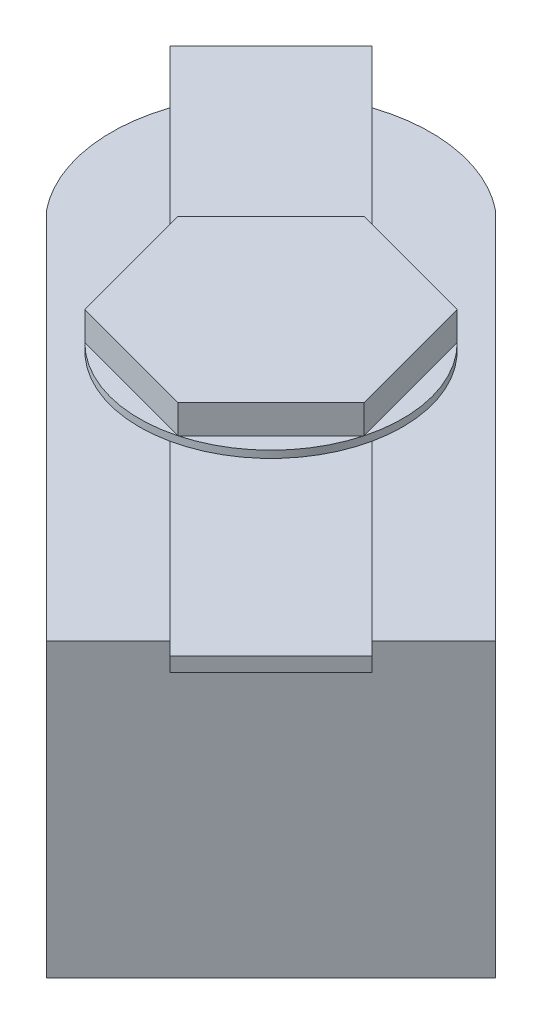
ISO-10303-21;
HEADER;
FILE_DESCRIPTION(('STEP AP214'),'2;1');
FILE_NAME('part.step','',(''),(''),'','','');
FILE_SCHEMA(('AUTOMOTIVE_DESIGN { 1 0 10303 214 1 1 1 1 }'));
ENDSEC;
DATA;
#1=APPLICATION_CONTEXT('core data for automotive mechanical design processes');
#2=APPLICATION_PROTOCOL_DEFINITION('international standard','automotive_design',2000,#1);
#3=PRODUCT_CONTEXT('',#1,'mechanical');
#4=PRODUCT('Part','Part','',(#3));
#5=PRODUCT_RELATED_PRODUCT_CATEGORY('part','',(#4));
#6=PRODUCT_DEFINITION_FORMATION('','',#4);
#7=PRODUCT_DEFINITION_CONTEXT('part definition',#1,'design');
#8=PRODUCT_DEFINITION('design','',#6,#7);
#9=PRODUCT_DEFINITION_SHAPE('','',#8);
#10=(LENGTH_UNIT() NAMED_UNIT(*) SI_UNIT(.MILLI.,.METRE.));
#11=(NAMED_UNIT(*) PLANE_ANGLE_UNIT() SI_UNIT($,.RADIAN.));
#12=(NAMED_UNIT(*) SI_UNIT($,.STERADIAN.) SOLID_ANGLE_UNIT());
#13=UNCERTAINTY_MEASURE_WITH_UNIT(LENGTH_MEASURE(1.E-05),#10,'distance_accuracy_value','');
#14=(GEOMETRIC_REPRESENTATION_CONTEXT(3) GLOBAL_UNCERTAINTY_ASSIGNED_CONTEXT((#13)) GLOBAL_UNIT_ASSIGNED_CONTEXT((#10,
#11,#12)) REPRESENTATION_CONTEXT('',''));
#15=CARTESIAN_POINT('',(0.,0.,0.));
#16=DIRECTION('',(0.,0.,1.));
#17=DIRECTION('',(1.,0.,0.));
#18=AXIS2_PLACEMENT_3D('',#15,#16,#17);
#19=CARTESIAN_POINT('',(0.,10.7,0.));
#20=DIRECTION('',(0.,1.,0.));
#21=DIRECTION('',(0.,0.,1.));
#22=AXIS2_PLACEMENT_3D('',#19,#20,#21);
#23=PLANE('',#22);
#24=DIRECTION('',(0.707106781186548,0.,0.707106781186548));
#25=VECTOR('',#24,1.);
#26=CARTESIAN_POINT('',(1.76776695296635,10.7,-1.76776695296635));
#27=LINE('',#26,#25);
#28=CARTESIAN_POINT('',(4.49815154126155,10.7,0.962617635328844));
#29=VERTEX_POINT('',#28);
#30=CARTESIAN_POINT('',(10.9955104474508,10.7,7.45997654151807));
#31=VERTEX_POINT('',#30);
#32=EDGE_CURVE('E308',#29,#31,#27,.T.);
#33=ORIENTED_EDGE('',*,*,#32,.F.);
#34=CARTESIAN_POINT('',(0.,10.7,0.));
#35=DIRECTION('',(0.,1.,0.));
#36=DIRECTION('',(0.,0.,1.));
#37=AXIS2_PLACEMENT_3D('',#34,#35,#36);
#38=CIRCLE('',#37,4.6);
#39=CARTESIAN_POINT('',(0.962617635328822,10.7,4.49815154126159));
#40=VERTEX_POINT('',#39);
#41=EDGE_CURVE('E251',#40,#29,#38,.T.);
#42=ORIENTED_EDGE('',*,*,#41,.F.);
#43=DIRECTION('',(0.707106781186548,0.,0.707106781186548));
#44=VECTOR('',#43,1.);
#45=CARTESIAN_POINT('',(-1.76776695296639,10.7,1.76776695296639));
#46=LINE('',#45,#44);
#47=CARTESIAN_POINT('',(7.45997654151804,10.7,10.9955104474508));
#48=VERTEX_POINT('',#47);
#49=EDGE_CURVE('E304',#40,#48,#46,.T.);
#50=ORIENTED_EDGE('',*,*,#49,.T.);
#51=DIRECTION('',(0.707106781186548,0.,-0.707106781186548));
#52=VECTOR('',#51,1.);
#53=CARTESIAN_POINT('',(9.22774349448443,10.7,9.22774349448443));
#54=LINE('',#53,#52);
#55=EDGE_CURVE('E303',#48,#31,#54,.T.);
#56=ORIENTED_EDGE('',*,*,#55,.T.);
#57=EDGE_LOOP('',(#33,#42,#50,#56));
#58=FACE_BOUND('',#57,.T.);
#59=ADVANCED_FACE('F47',(#58),#23,.T.);
#60=CARTESIAN_POINT('',(0.,10.2,0.));
#61=DIRECTION('',(0.,1.,0.));
#62=DIRECTION('',(0.,0.,1.));
#63=AXIS2_PLACEMENT_3D('',#60,#61,#62);
#64=PLANE('',#63);
#65=CARTESIAN_POINT('',(-4.32731672416639,10.2,-4.32731672416636));
#66=DIRECTION('',(0.,1.,0.));
#67=DIRECTION('',(0.,0.,1.));
#68=AXIS2_PLACEMENT_3D('',#65,#66,#67);
#69=CIRCLE('',#68,5.58025);
#70=CARTESIAN_POINT('',(-6.08723952956172,10.2,-9.62277343549442));
#71=VERTEX_POINT('',#70);
#72=CARTESIAN_POINT('',(-0.813172798364616,10.2,-8.66205806953525));
#73=VERTEX_POINT('',#72);
#74=EDGE_CURVE('E352',#71,#73,#69,.F.);
#75=ORIENTED_EDGE('',*,*,#74,.F.);
#76=DIRECTION('',(0.707106781186548,0.,0.707106781186548));
#77=VECTOR('',#76,1.);
#78=CARTESIAN_POINT('',(1.76776695296635,10.2,-1.76776695296635));
#79=LINE('',#78,#77);
#80=CARTESIAN_POINT('',(10.040916292849,10.2,6.50538238691625));
#81=VERTEX_POINT('',#80);
#82=EDGE_CURVE('E57',#71,#81,#79,.T.);
#83=ORIENTED_EDGE('',*,*,#82,.T.);
#84=DIRECTION('',(0.707106781186544,0.,-0.707106781186551));
#85=VECTOR('',#84,1.);
#86=CARTESIAN_POINT('',(8.27314933988265,10.2,8.27314933988256));
#87=LINE('',#86,#85);
#88=CARTESIAN_POINT('',(12.197591975468,10.2,4.34870670429721));
#89=VERTEX_POINT('',#88);
#90=EDGE_CURVE('E355',#81,#89,#87,.T.);
#91=ORIENTED_EDGE('',*,*,#90,.T.);
#92=DIRECTION('',(0.70710678118655,0.,0.707106781186545));
#93=VECTOR('',#92,1.);
#94=CARTESIAN_POINT('',(3.92444263558532,10.2,-3.92444263558535));
#95=LINE('',#94,#93);
#96=EDGE_CURVE('E360',#73,#89,#95,.T.);
#97=ORIENTED_EDGE('',*,*,#96,.F.);
#98=EDGE_LOOP('',(#75,#83,#91,#97));
#99=FACE_BOUND('',#98,.T.);
#100=ADVANCED_FACE('F435',(#99),#64,.T.);
#101=CARTESIAN_POINT('',(-4.32731672416639,10.2,-4.32731672416636));
#102=DIRECTION('',(0.,-1.,0.));
#103=DIRECTION('',(0.,0.,-1.));
#104=AXIS2_PLACEMENT_3D('',#101,#102,#103);
#105=CYLINDRICAL_SURFACE('',#104,5.58025);
#106=CARTESIAN_POINT('',(-4.32731672416639,0.,-4.32731672416636));
#107=DIRECTION('',(0.,1.,0.));
#108=DIRECTION('',(0.,0.,1.));
#109=AXIS2_PLACEMENT_3D('',#106,#107,#108);
#110=CIRCLE('',#109,5.58025);
#111=CARTESIAN_POINT('',(-8.66205806953523,0.,-0.813172798364517));
#112=VERTEX_POINT('',#111);
#113=CARTESIAN_POINT('',(-0.813172798364616,0.,-8.66205806953525));
#114=VERTEX_POINT('',#113);
#115=EDGE_CURVE('E345',#112,#114,#110,.F.);
#116=ORIENTED_EDGE('',*,*,#115,.F.);
#117=DIRECTION('',(0.,-1.,0.));
#118=VECTOR('',#117,1.);
#119=CARTESIAN_POINT('',(-8.66205806953523,10.2,-0.813172798364517));
#120=LINE('',#119,#118);
#121=CARTESIAN_POINT('',(-8.66205806953523,10.2,-0.813172798364517));
#122=VERTEX_POINT('',#121);
#123=EDGE_CURVE('E51',#122,#112,#120,.T.);
#124=ORIENTED_EDGE('',*,*,#123,.F.);
#125=CARTESIAN_POINT('',(-9.62277343549446,10.2,-6.08723952956169));
#126=VERTEX_POINT('',#125);
#127=EDGE_CURVE('E346',#122,#126,#69,.F.);
#128=ORIENTED_EDGE('',*,*,#127,.T.);
#129=EDGE_CURVE('E351',#126,#71,#69,.F.);
#130=ORIENTED_EDGE('',*,*,#129,.T.);
#131=ORIENTED_EDGE('',*,*,#74,.T.);
#132=DIRECTION('',(0.,-1.,0.));
#133=VECTOR('',#132,1.);
#134=CARTESIAN_POINT('',(-0.813172798364616,10.2,-8.66205806953525));
#135=LINE('',#134,#133);
#136=EDGE_CURVE('E365',#73,#114,#135,.T.);
#137=ORIENTED_EDGE('',*,*,#136,.T.);
#138=EDGE_LOOP('',(#116,#124,#128,#130,#131,#137));
#139=FACE_BOUND('',#138,.T.);
#140=ADVANCED_FACE('F49',(#139),#105,.T.);
#141=CARTESIAN_POINT('',(-3.92444263558531,10.2,3.92444263558535));
#142=DIRECTION('',(0.707106781186544,0.,-0.707106781186551));
#143=DIRECTION('',(-0.707106781186551,0.,-0.707106781186544));
#144=AXIS2_PLACEMENT_3D('',#141,#142,#143);
#145=PLANE('',#144);
#146=DIRECTION('',(0.707106781186551,0.,0.707106781186544));
#147=VECTOR('',#146,1.);
#148=CARTESIAN_POINT('',(-3.92444263558531,0.,3.92444263558535));
#149=LINE('',#148,#147);
#150=CARTESIAN_POINT('',(4.34870670429734,0.,12.1975919754679));
#151=VERTEX_POINT('',#150);
#152=EDGE_CURVE('E369',#112,#151,#149,.T.);
#153=ORIENTED_EDGE('',*,*,#152,.T.);
#154=DIRECTION('',(0.,-1.,0.));
#155=VECTOR('',#154,1.);
#156=CARTESIAN_POINT('',(4.34870670429734,10.2,12.1975919754679));
#157=LINE('',#156,#155);
#158=CARTESIAN_POINT('',(4.34870670429734,10.2,12.1975919754679));
#159=VERTEX_POINT('',#158);
#160=EDGE_CURVE('E384',#159,#151,#157,.T.);
#161=ORIENTED_EDGE('',*,*,#160,.F.);
#162=DIRECTION('',(0.707106781186551,0.,0.707106781186544));
#163=VECTOR('',#162,1.);
#164=CARTESIAN_POINT('',(-3.92444263558531,10.2,3.92444263558535));
#165=LINE('',#164,#163);
#166=EDGE_CURVE('E350',#122,#159,#165,.T.);
#167=ORIENTED_EDGE('',*,*,#166,.F.);
#168=ORIENTED_EDGE('',*,*,#123,.T.);
#169=EDGE_LOOP('',(#153,#161,#167,#168));
#170=FACE_BOUND('',#169,.T.);
#171=ADVANCED_FACE('F424',(#170),#145,.F.);
#172=CARTESIAN_POINT('',(8.27314933988265,10.2,8.27314933988256));
#173=DIRECTION('',(-0.707106781186551,0.,-0.707106781186544));
#174=DIRECTION('',(-0.707106781186544,0.,0.707106781186551));
#175=AXIS2_PLACEMENT_3D('',#172,#173,#174);
#176=PLANE('',#175);
#177=DIRECTION('',(0.707106781186544,0.,-0.707106781186551));
#178=VECTOR('',#177,1.);
#179=CARTESIAN_POINT('',(8.27314933988265,0.,8.27314933988256));
#180=LINE('',#179,#178);
#181=CARTESIAN_POINT('',(12.197591975468,0.,4.34870670429721));
#182=VERTEX_POINT('',#181);
#183=EDGE_CURVE('E372',#151,#182,#180,.T.);
#184=ORIENTED_EDGE('',*,*,#183,.T.);
#185=DIRECTION('',(0.,-1.,0.));
#186=VECTOR('',#185,1.);
#187=CARTESIAN_POINT('',(12.197591975468,10.2,4.34870670429721));
#188=LINE('',#187,#186);
#189=EDGE_CURVE('E382',#89,#182,#188,.T.);
#190=ORIENTED_EDGE('',*,*,#189,.F.);
#191=ORIENTED_EDGE('',*,*,#90,.F.);
#192=CARTESIAN_POINT('',(6.50538238691623,10.2,10.040916292849));
#193=VERTEX_POINT('',#192);
#194=EDGE_CURVE('E361',#193,#81,#87,.T.);
#195=ORIENTED_EDGE('',*,*,#194,.F.);
#196=EDGE_CURVE('E356',#159,#193,#87,.T.);
#197=ORIENTED_EDGE('',*,*,#196,.F.);
#198=ORIENTED_EDGE('',*,*,#160,.T.);
#199=EDGE_LOOP('',(#184,#190,#191,#195,#197,#198));
#200=FACE_BOUND('',#199,.T.);
#201=ADVANCED_FACE('F420',(#200),#176,.F.);
#202=CARTESIAN_POINT('',(3.92444263558532,10.2,-3.92444263558535));
#203=DIRECTION('',(0.707106781186545,0.,-0.70710678118655));
#204=DIRECTION('',(-0.70710678118655,0.,-0.707106781186545));
#205=AXIS2_PLACEMENT_3D('',#202,#203,#204);
#206=PLANE('',#205);
#207=DIRECTION('',(0.70710678118655,0.,0.707106781186545));
#208=VECTOR('',#207,1.);
#209=CARTESIAN_POINT('',(3.92444263558532,0.,-3.92444263558535));
#210=LINE('',#209,#208);
#211=EDGE_CURVE('E376',#114,#182,#210,.T.);
#212=ORIENTED_EDGE('',*,*,#211,.F.);
#213=ORIENTED_EDGE('',*,*,#136,.F.);
#214=ORIENTED_EDGE('',*,*,#96,.T.);
#215=ORIENTED_EDGE('',*,*,#189,.T.);
#216=EDGE_LOOP('',(#212,#213,#214,#215));
#217=FACE_BOUND('',#216,.T.);
#218=ADVANCED_FACE('F434',(#217),#206,.T.);
#219=DIRECTION('',(0.707106781186548,0.,0.707106781186548));
#220=VECTOR('',#219,1.);
#221=CARTESIAN_POINT('',(-1.76776695296639,10.2,1.76776695296639));
#222=LINE('',#221,#220);
#223=EDGE_CURVE('E11',#126,#193,#222,.T.);
#224=ORIENTED_EDGE('',*,*,#223,.F.);
#225=ORIENTED_EDGE('',*,*,#127,.F.);
#226=ORIENTED_EDGE('',*,*,#166,.T.);
#227=ORIENTED_EDGE('',*,*,#196,.T.);
#228=EDGE_LOOP('',(#224,#225,#226,#227));
#229=FACE_BOUND('',#228,.T.);
#230=ADVANCED_FACE('F423',(#229),#64,.T.);
#231=CARTESIAN_POINT('',(0.,0.,0.));
#232=DIRECTION('',(0.,1.,0.));
#233=DIRECTION('',(0.,0.,1.));
#234=AXIS2_PLACEMENT_3D('',#231,#232,#233);
#235=PLANE('',#234);
#236=ORIENTED_EDGE('',*,*,#115,.T.);
#237=ORIENTED_EDGE('',*,*,#211,.T.);
#238=ORIENTED_EDGE('',*,*,#183,.F.);
#239=ORIENTED_EDGE('',*,*,#152,.F.);
#240=EDGE_LOOP('',(#236,#237,#238,#239));
#241=FACE_BOUND('',#240,.T.);
#242=ADVANCED_FACE('F427',(#241),#235,.F.);
#243=CARTESIAN_POINT('',(0.,10.2,0.));
#244=DIRECTION('',(0.,1.,0.));
#245=DIRECTION('',(0.,0.,1.));
#246=AXIS2_PLACEMENT_3D('',#243,#244,#245);
#247=PLANE('',#246);
#248=CARTESIAN_POINT('',(7.45997654151804,10.2,10.9955104474508));
#249=VERTEX_POINT('',#248);
#250=EDGE_CURVE('E60',#193,#249,#222,.T.);
#251=ORIENTED_EDGE('',*,*,#250,.F.);
#252=ORIENTED_EDGE('',*,*,#194,.T.);
#253=CARTESIAN_POINT('',(10.9955104474508,10.2,7.45997654151807));
#254=VERTEX_POINT('',#253);
#255=EDGE_CURVE('E323',#81,#254,#79,.T.);
#256=ORIENTED_EDGE('',*,*,#255,.T.);
#257=DIRECTION('',(0.707106781186548,0.,-0.707106781186548));
#258=VECTOR('',#257,1.);
#259=CARTESIAN_POINT('',(9.22774349448443,10.2,9.22774349448443));
#260=LINE('',#259,#258);
#261=EDGE_CURVE('E319',#249,#254,#260,.T.);
#262=ORIENTED_EDGE('',*,*,#261,.F.);
#263=EDGE_LOOP('',(#251,#252,#256,#262));
#264=FACE_BOUND('',#263,.T.);
#265=ADVANCED_FACE('F404',(#264),#247,.F.);
#266=CARTESIAN_POINT('',(-1.76776695296639,10.7,1.76776695296639));
#267=DIRECTION('',(0.707106781186547,0.,-0.707106781186547));
#268=DIRECTION('',(-0.707106781186548,0.,-0.707106781186548));
#269=AXIS2_PLACEMENT_3D('',#266,#267,#268);
#270=PLANE('',#269);
#271=CARTESIAN_POINT('',(-10.9955104474508,10.2,-7.45997654151808));
#272=VERTEX_POINT('',#271);
#273=EDGE_CURVE('E59',#272,#126,#222,.T.);
#274=ORIENTED_EDGE('',*,*,#273,.T.);
#275=ORIENTED_EDGE('',*,*,#223,.T.);
#276=ORIENTED_EDGE('',*,*,#250,.T.);
#277=DIRECTION('',(0.,-1.,0.));
#278=VECTOR('',#277,1.);
#279=CARTESIAN_POINT('',(7.45997654151804,10.7,10.9955104474508));
#280=LINE('',#279,#278);
#281=EDGE_CURVE('E341',#48,#249,#280,.T.);
#282=ORIENTED_EDGE('',*,*,#281,.F.);
#283=ORIENTED_EDGE('',*,*,#49,.F.);
#284=CARTESIAN_POINT('',(-4.4981515412616,10.7,-0.962617635328828));
#285=VERTEX_POINT('',#284);
#286=EDGE_CURVE('E75',#285,#40,#46,.T.);
#287=ORIENTED_EDGE('',*,*,#286,.F.);
#288=CARTESIAN_POINT('',(-10.9955104474508,10.7,-7.45997654151808));
#289=VERTEX_POINT('',#288);
#290=EDGE_CURVE('E299',#289,#285,#46,.T.);
#291=ORIENTED_EDGE('',*,*,#290,.F.);
#292=DIRECTION('',(0.,-1.,0.));
#293=VECTOR('',#292,1.);
#294=CARTESIAN_POINT('',(-10.9955104474508,10.7,-7.45997654151808));
#295=LINE('',#294,#293);
#296=EDGE_CURVE('E315',#289,#272,#295,.T.);
#297=ORIENTED_EDGE('',*,*,#296,.T.);
#298=EDGE_LOOP('',(#274,#275,#276,#282,#283,#287,#291,#297));
#299=FACE_BOUND('',#298,.T.);
#300=ADVANCED_FACE('F414',(#299),#270,.F.);
#301=CARTESIAN_POINT('',(9.22774349448443,10.7,9.22774349448443));
#302=DIRECTION('',(-0.707106781186547,0.,-0.707106781186547));
#303=DIRECTION('',(-0.707106781186548,0.,0.707106781186548));
#304=AXIS2_PLACEMENT_3D('',#301,#302,#303);
#305=PLANE('',#304);
#306=ORIENTED_EDGE('',*,*,#261,.T.);
#307=DIRECTION('',(0.,-1.,0.));
#308=VECTOR('',#307,1.);
#309=CARTESIAN_POINT('',(10.9955104474508,10.7,7.45997654151807));
#310=LINE('',#309,#308);
#311=EDGE_CURVE('E337',#31,#254,#310,.T.);
#312=ORIENTED_EDGE('',*,*,#311,.F.);
#313=ORIENTED_EDGE('',*,*,#55,.F.);
#314=ORIENTED_EDGE('',*,*,#281,.T.);
#315=EDGE_LOOP('',(#306,#312,#313,#314));
#316=FACE_BOUND('',#315,.T.);
#317=ADVANCED_FACE('F412',(#316),#305,.F.);
#318=CARTESIAN_POINT('',(1.76776695296635,10.7,-1.76776695296635));
#319=DIRECTION('',(0.707106781186547,0.,-0.707106781186547));
#320=DIRECTION('',(-0.707106781186548,0.,-0.707106781186548));
#321=AXIS2_PLACEMENT_3D('',#318,#319,#320);
#322=PLANE('',#321);
#323=CARTESIAN_POINT('',(-7.45997654151811,10.2,-10.9955104474508));
#324=VERTEX_POINT('',#323);
#325=EDGE_CURVE('E324',#324,#71,#79,.T.);
#326=ORIENTED_EDGE('',*,*,#325,.F.);
#327=DIRECTION('',(0.,-1.,0.));
#328=VECTOR('',#327,1.);
#329=CARTESIAN_POINT('',(-7.45997654151811,10.7,-10.9955104474508));
#330=LINE('',#329,#328);
#331=CARTESIAN_POINT('',(-7.45997654151811,10.7,-10.9955104474508));
#332=VERTEX_POINT('',#331);
#333=EDGE_CURVE('E334',#332,#324,#330,.T.);
#334=ORIENTED_EDGE('',*,*,#333,.F.);
#335=CARTESIAN_POINT('',(-0.96261763532885,10.7,-4.49815154126156));
#336=VERTEX_POINT('',#335);
#337=EDGE_CURVE('E309',#332,#336,#27,.T.);
#338=ORIENTED_EDGE('',*,*,#337,.T.);
#339=EDGE_CURVE('E67',#336,#29,#27,.T.);
#340=ORIENTED_EDGE('',*,*,#339,.T.);
#341=ORIENTED_EDGE('',*,*,#32,.T.);
#342=ORIENTED_EDGE('',*,*,#311,.T.);
#343=ORIENTED_EDGE('',*,*,#255,.F.);
#344=ORIENTED_EDGE('',*,*,#82,.F.);
#345=EDGE_LOOP('',(#326,#334,#338,#340,#341,#342,#343,#344));
#346=FACE_BOUND('',#345,.T.);
#347=ADVANCED_FACE('F408',(#346),#322,.T.);
#348=CARTESIAN_POINT('',(-9.22774349448446,10.7,-9.22774349448446));
#349=DIRECTION('',(-0.707106781186547,0.,-0.707106781186548));
#350=DIRECTION('',(-0.707106781186548,0.,0.707106781186547));
#351=AXIS2_PLACEMENT_3D('',#348,#349,#350);
#352=PLANE('',#351);
#353=DIRECTION('',(0.707106781186548,0.,-0.707106781186547));
#354=VECTOR('',#353,1.);
#355=CARTESIAN_POINT('',(-9.22774349448446,10.2,-9.22774349448446));
#356=LINE('',#355,#354);
#357=EDGE_CURVE('E328',#272,#324,#356,.T.);
#358=ORIENTED_EDGE('',*,*,#357,.F.);
#359=ORIENTED_EDGE('',*,*,#296,.F.);
#360=DIRECTION('',(0.707106781186548,0.,-0.707106781186547));
#361=VECTOR('',#360,1.);
#362=CARTESIAN_POINT('',(-9.22774349448446,10.7,-9.22774349448446));
#363=LINE('',#362,#361);
#364=EDGE_CURVE('E312',#289,#332,#363,.T.);
#365=ORIENTED_EDGE('',*,*,#364,.T.);
#366=ORIENTED_EDGE('',*,*,#333,.T.);
#367=EDGE_LOOP('',(#358,#359,#365,#366));
#368=FACE_BOUND('',#367,.T.);
#369=ADVANCED_FACE('F478',(#368),#352,.T.);
#370=CARTESIAN_POINT('',(0.,10.7,0.));
#371=DIRECTION('',(0.,1.,0.));
#372=DIRECTION('',(0.,0.,1.));
#373=AXIS2_PLACEMENT_3D('',#370,#371,#372);
#374=CIRCLE('',#373,4.6);
#375=EDGE_CURVE('E241',#336,#285,#374,.T.);
#376=ORIENTED_EDGE('',*,*,#375,.F.);
#377=ORIENTED_EDGE('',*,*,#337,.F.);
#378=ORIENTED_EDGE('',*,*,#364,.F.);
#379=ORIENTED_EDGE('',*,*,#290,.T.);
#380=EDGE_LOOP('',(#376,#377,#378,#379));
#381=FACE_BOUND('',#380,.T.);
#382=ADVANCED_FACE('F461',(#381),#23,.T.);
#383=ORIENTED_EDGE('',*,*,#129,.F.);
#384=ORIENTED_EDGE('',*,*,#273,.F.);
#385=ORIENTED_EDGE('',*,*,#357,.T.);
#386=ORIENTED_EDGE('',*,*,#325,.T.);
#387=EDGE_LOOP('',(#383,#384,#385,#386));
#388=FACE_BOUND('',#387,.T.);
#389=ADVANCED_FACE('F451',(#388),#247,.F.);
#390=CARTESIAN_POINT('',(0.,10.7,0.));
#391=DIRECTION('',(0.,1.,0.));
#392=DIRECTION('',(0.,0.,1.));
#393=AXIS2_PLACEMENT_3D('',#390,#391,#392);
#394=PLANE('',#393);
#395=CARTESIAN_POINT('',(0.,10.7,0.));
#396=DIRECTION('',(0.,1.,0.));
#397=DIRECTION('',(0.,0.,1.));
#398=AXIS2_PLACEMENT_3D('',#395,#396,#397);
#399=CIRCLE('',#398,4.6);
#400=EDGE_CURVE('E233',#285,#40,#399,.T.);
#401=ORIENTED_EDGE('',*,*,#400,.F.);
#402=ORIENTED_EDGE('',*,*,#286,.T.);
#403=EDGE_LOOP('',(#401,#402));
#404=FACE_BOUND('',#403,.T.);
#405=ADVANCED_FACE('F448',(#404),#394,.F.);
#406=ORIENTED_EDGE('',*,*,#339,.F.);
#407=CARTESIAN_POINT('',(0.,10.7,0.));
#408=DIRECTION('',(0.,1.,0.));
#409=DIRECTION('',(0.,0.,1.));
#410=AXIS2_PLACEMENT_3D('',#407,#408,#409);
#411=CIRCLE('',#410,4.6);
#412=EDGE_CURVE('E212',#29,#336,#411,.T.);
#413=ORIENTED_EDGE('',*,*,#412,.F.);
#414=EDGE_LOOP('',(#406,#413));
#415=FACE_BOUND('',#414,.T.);
#416=ADVANCED_FACE('F450',(#415),#394,.F.);
#417=CARTESIAN_POINT('',(-2.81691320420067,11.95,-2.81691320420067));
#418=DIRECTION('',(0.707106781186548,0.,0.707106781186547));
#419=DIRECTION('',(0.707106781186547,0.,-0.707106781186548));
#420=AXIS2_PLACEMENT_3D('',#417,#418,#419);
#421=PLANE('',#420);
#422=DIRECTION('',(0.,-1.,0.));
#423=VECTOR('',#422,1.);
#424=CARTESIAN_POINT('',(-1.19056760747162,11.95,-4.44325880092971));
#425=LINE('',#424,#423);
#426=CARTESIAN_POINT('',(-1.19056760747162,11.95,-4.44325880092971));
#427=VERTEX_POINT('',#426);
#428=CARTESIAN_POINT('',(-1.19056760747162,10.95,-4.44325880092971));
#429=VERTEX_POINT('',#428);
#430=EDGE_CURVE('E217',#427,#429,#425,.T.);
#431=ORIENTED_EDGE('',*,*,#430,.T.);
#432=DIRECTION('',(-0.707106781186547,0.,0.707106781186548));
#433=VECTOR('',#432,1.);
#434=CARTESIAN_POINT('',(-2.81691320420067,10.95,-2.81691320420067));
#435=LINE('',#434,#433);
#436=CARTESIAN_POINT('',(-4.44325880092974,10.95,-1.19056760747159));
#437=VERTEX_POINT('',#436);
#438=EDGE_CURVE('E245',#429,#437,#435,.T.);
#439=ORIENTED_EDGE('',*,*,#438,.T.);
#440=DIRECTION('',(0.,-1.,0.));
#441=VECTOR('',#440,1.);
#442=CARTESIAN_POINT('',(-4.44325880092974,11.95,-1.19056760747159));
#443=LINE('',#442,#441);
#444=CARTESIAN_POINT('',(-4.44325880092974,11.95,-1.19056760747159));
#445=VERTEX_POINT('',#444);
#446=EDGE_CURVE('E269',#445,#437,#443,.T.);
#447=ORIENTED_EDGE('',*,*,#446,.F.);
#448=DIRECTION('',(-0.707106781186547,0.,0.707106781186548));
#449=VECTOR('',#448,1.);
#450=CARTESIAN_POINT('',(-2.81691320420067,11.95,-2.81691320420067));
#451=LINE('',#450,#449);
#452=EDGE_CURVE('E268',#427,#445,#451,.T.);
#453=ORIENTED_EDGE('',*,*,#452,.F.);
#454=EDGE_LOOP('',(#431,#439,#447,#453));
#455=FACE_BOUND('',#454,.T.);
#456=ADVANCED_FACE('F453',(#455),#421,.F.);
#457=CARTESIAN_POINT('',(1.03106179299326,11.95,-3.84797499719391));
#458=DIRECTION('',(-0.258819045102521,0.,0.965925826289068));
#459=DIRECTION('',(0.965925826289068,0.,0.258819045102521));
#460=AXIS2_PLACEMENT_3D('',#457,#458,#459);
#461=PLANE('',#460);
#462=DIRECTION('',(0.,-1.,0.));
#463=VECTOR('',#462,1.);
#464=CARTESIAN_POINT('',(3.25269119345809,11.95,-3.25269119345812));
#465=LINE('',#464,#463);
#466=CARTESIAN_POINT('',(3.25269119345809,11.95,-3.25269119345812));
#467=VERTEX_POINT('',#466);
#468=CARTESIAN_POINT('',(3.25269119345809,10.95,-3.25269119345812));
#469=VERTEX_POINT('',#468);
#470=EDGE_CURVE('E183',#467,#469,#465,.T.);
#471=ORIENTED_EDGE('',*,*,#470,.T.);
#472=DIRECTION('',(-0.965925826289068,0.,-0.258819045102521));
#473=VECTOR('',#472,1.);
#474=CARTESIAN_POINT('',(1.03106179299326,10.95,-3.84797499719391));
#475=LINE('',#474,#473);
#476=EDGE_CURVE('E206',#469,#429,#475,.T.);
#477=ORIENTED_EDGE('',*,*,#476,.T.);
#478=ORIENTED_EDGE('',*,*,#430,.F.);
#479=DIRECTION('',(-0.965925826289068,0.,-0.258819045102521));
#480=VECTOR('',#479,1.);
#481=CARTESIAN_POINT('',(1.03106179299326,11.95,-3.84797499719391));
#482=LINE('',#481,#480);
#483=EDGE_CURVE('E215',#467,#427,#482,.T.);
#484=ORIENTED_EDGE('',*,*,#483,.F.);
#485=EDGE_LOOP('',(#471,#477,#478,#484));
#486=FACE_BOUND('',#485,.T.);
#487=ADVANCED_FACE('F214',(#486),#461,.F.);
#488=CARTESIAN_POINT('',(3.84797499719389,11.95,-1.03106179299326));
#489=DIRECTION('',(-0.965925826289068,0.,0.258819045102521));
#490=DIRECTION('',(0.258819045102521,0.,0.965925826289068));
#491=AXIS2_PLACEMENT_3D('',#488,#489,#490);
#492=PLANE('',#491);
#493=DIRECTION('',(0.,-1.,0.));
#494=VECTOR('',#493,1.);
#495=CARTESIAN_POINT('',(4.44325880092969,11.95,1.1905676074716));
#496=LINE('',#495,#494);
#497=CARTESIAN_POINT('',(4.44325880092969,11.95,1.1905676074716));
#498=VERTEX_POINT('',#497);
#499=CARTESIAN_POINT('',(4.44325880092969,10.95,1.1905676074716));
#500=VERTEX_POINT('',#499);
#501=EDGE_CURVE('E186',#498,#500,#496,.T.);
#502=ORIENTED_EDGE('',*,*,#501,.T.);
#503=DIRECTION('',(-0.258819045102521,0.,-0.965925826289068));
#504=VECTOR('',#503,1.);
#505=CARTESIAN_POINT('',(3.84797499719389,10.95,-1.03106179299326));
#506=LINE('',#505,#504);
#507=EDGE_CURVE('E179',#500,#469,#506,.T.);
#508=ORIENTED_EDGE('',*,*,#507,.T.);
#509=ORIENTED_EDGE('',*,*,#470,.F.);
#510=DIRECTION('',(-0.258819045102521,0.,-0.965925826289068));
#511=VECTOR('',#510,1.);
#512=CARTESIAN_POINT('',(3.84797499719389,11.95,-1.03106179299326));
#513=LINE('',#512,#511);
#514=EDGE_CURVE('E218',#498,#467,#513,.T.);
#515=ORIENTED_EDGE('',*,*,#514,.F.);
#516=EDGE_LOOP('',(#502,#508,#509,#515));
#517=FACE_BOUND('',#516,.T.);
#518=ADVANCED_FACE('F181',(#517),#492,.F.);
#519=CARTESIAN_POINT('',(0.,11.95,0.));
#520=DIRECTION('',(0.,1.,0.));
#521=DIRECTION('',(0.,0.,1.));
#522=AXIS2_PLACEMENT_3D('',#519,#520,#521);
#523=PLANE('',#522);
#524=ORIENTED_EDGE('',*,*,#483,.T.);
#525=ORIENTED_EDGE('',*,*,#452,.T.);
#526=DIRECTION('',(0.258819045102521,0.,0.965925826289068));
#527=VECTOR('',#526,1.);
#528=CARTESIAN_POINT('',(-4.44325880092974,11.95,-1.19056760747159));
#529=LINE('',#528,#527);
#530=CARTESIAN_POINT('',(-3.25269119345814,11.95,3.25269119345813));
#531=VERTEX_POINT('',#530);
#532=EDGE_CURVE('E262',#445,#531,#529,.T.);
#533=ORIENTED_EDGE('',*,*,#532,.T.);
#534=DIRECTION('',(0.965925826289068,0.,0.258819045102521));
#535=VECTOR('',#534,1.);
#536=CARTESIAN_POINT('',(-3.25269119345814,11.95,3.25269119345813));
#537=LINE('',#536,#535);
#538=CARTESIAN_POINT('',(1.19056760747157,11.95,4.44325880092972));
#539=VERTEX_POINT('',#538);
#540=EDGE_CURVE('E279',#531,#539,#537,.T.);
#541=ORIENTED_EDGE('',*,*,#540,.T.);
#542=DIRECTION('',(0.707106781186547,0.,-0.707106781186548));
#543=VECTOR('',#542,1.);
#544=CARTESIAN_POINT('',(1.19056760747157,11.95,4.44325880092972));
#545=LINE('',#544,#543);
#546=EDGE_CURVE('E282',#539,#498,#545,.T.);
#547=ORIENTED_EDGE('',*,*,#546,.T.);
#548=ORIENTED_EDGE('',*,*,#514,.T.);
#549=EDGE_LOOP('',(#524,#525,#533,#541,#547,#548));
#550=FACE_BOUND('',#549,.T.);
#551=ADVANCED_FACE('F667',(#550),#523,.T.);
#552=CARTESIAN_POINT('',(-4.44325880092974,11.95,-1.19056760747159));
#553=DIRECTION('',(0.965925826289068,0.,-0.258819045102521));
#554=DIRECTION('',(-0.258819045102521,0.,-0.965925826289068));
#555=AXIS2_PLACEMENT_3D('',#552,#553,#554);
#556=PLANE('',#555);
#557=ORIENTED_EDGE('',*,*,#446,.T.);
#558=DIRECTION('',(0.258819045102521,0.,0.965925826289068));
#559=VECTOR('',#558,1.);
#560=CARTESIAN_POINT('',(-3.84797499719394,10.95,1.03106179299327));
#561=LINE('',#560,#559);
#562=CARTESIAN_POINT('',(-3.25269119345814,10.95,3.25269119345813));
#563=VERTEX_POINT('',#562);
#564=EDGE_CURVE('E205',#437,#563,#561,.T.);
#565=ORIENTED_EDGE('',*,*,#564,.T.);
#566=DIRECTION('',(0.,-1.,0.));
#567=VECTOR('',#566,1.);
#568=CARTESIAN_POINT('',(-3.25269119345814,11.95,3.25269119345813));
#569=LINE('',#568,#567);
#570=EDGE_CURVE('E292',#531,#563,#569,.T.);
#571=ORIENTED_EDGE('',*,*,#570,.F.);
#572=ORIENTED_EDGE('',*,*,#532,.F.);
#573=EDGE_LOOP('',(#557,#565,#571,#572));
#574=FACE_BOUND('',#573,.T.);
#575=ADVANCED_FACE('F674',(#574),#556,.F.);
#576=CARTESIAN_POINT('',(-3.25269119345814,11.95,3.25269119345813));
#577=DIRECTION('',(0.258819045102521,0.,-0.965925826289068));
#578=DIRECTION('',(-0.965925826289068,0.,-0.258819045102521));
#579=AXIS2_PLACEMENT_3D('',#576,#577,#578);
#580=PLANE('',#579);
#581=ORIENTED_EDGE('',*,*,#570,.T.);
#582=DIRECTION('',(0.965925826289068,0.,0.258819045102521));
#583=VECTOR('',#582,1.);
#584=CARTESIAN_POINT('',(-1.03106179299326,10.95,3.84797499719393));
#585=LINE('',#584,#583);
#586=CARTESIAN_POINT('',(1.19056760747157,10.95,4.44325880092972));
#587=VERTEX_POINT('',#586);
#588=EDGE_CURVE('E234',#563,#587,#585,.T.);
#589=ORIENTED_EDGE('',*,*,#588,.T.);
#590=DIRECTION('',(0.,-1.,0.));
#591=VECTOR('',#590,1.);
#592=CARTESIAN_POINT('',(1.19056760747157,11.95,4.44325880092972));
#593=LINE('',#592,#591);
#594=EDGE_CURVE('E288',#539,#587,#593,.T.);
#595=ORIENTED_EDGE('',*,*,#594,.F.);
#596=ORIENTED_EDGE('',*,*,#540,.F.);
#597=EDGE_LOOP('',(#581,#589,#595,#596));
#598=FACE_BOUND('',#597,.T.);
#599=ADVANCED_FACE('F682',(#598),#580,.F.);
#600=CARTESIAN_POINT('',(1.19056760747157,11.95,4.44325880092972));
#601=DIRECTION('',(-0.707106781186548,0.,-0.707106781186547));
#602=DIRECTION('',(-0.707106781186547,0.,0.707106781186548));
#603=AXIS2_PLACEMENT_3D('',#600,#601,#602);
#604=PLANE('',#603);
#605=ORIENTED_EDGE('',*,*,#594,.T.);
#606=DIRECTION('',(0.707106781186547,0.,-0.707106781186548));
#607=VECTOR('',#606,1.);
#608=CARTESIAN_POINT('',(2.81691320420065,10.95,2.81691320420064));
#609=LINE('',#608,#607);
#610=EDGE_CURVE('E255',#587,#500,#609,.T.);
#611=ORIENTED_EDGE('',*,*,#610,.T.);
#612=ORIENTED_EDGE('',*,*,#501,.F.);
#613=ORIENTED_EDGE('',*,*,#546,.F.);
#614=EDGE_LOOP('',(#605,#611,#612,#613));
#615=FACE_BOUND('',#614,.T.);
#616=ADVANCED_FACE('F596',(#615),#604,.F.);
#617=CARTESIAN_POINT('',(0.,10.95,0.));
#618=DIRECTION('',(0.,-1.,0.));
#619=DIRECTION('',(0.,0.,-1.));
#620=AXIS2_PLACEMENT_3D('',#617,#618,#619);
#621=CYLINDRICAL_SURFACE('',#620,4.6);
#622=ORIENTED_EDGE('',*,*,#41,.T.);
#623=ORIENTED_EDGE('',*,*,#412,.T.);
#624=ORIENTED_EDGE('',*,*,#375,.T.);
#625=ORIENTED_EDGE('',*,*,#400,.T.);
#626=EDGE_LOOP('',(#622,#623,#624,#625));
#627=FACE_BOUND('',#626,.T.);
#628=CARTESIAN_POINT('',(0.,10.95,0.));
#629=DIRECTION('',(0.,1.,0.));
#630=DIRECTION('',(0.,0.,1.));
#631=AXIS2_PLACEMENT_3D('',#628,#629,#630);
#632=CIRCLE('',#631,4.6);
#633=EDGE_CURVE('E195',#469,#429,#632,.T.);
#634=ORIENTED_EDGE('',*,*,#633,.F.);
#635=CARTESIAN_POINT('',(0.,10.95,0.));
#636=DIRECTION('',(0.,1.,0.));
#637=DIRECTION('',(0.,0.,1.));
#638=AXIS2_PLACEMENT_3D('',#635,#636,#637);
#639=CIRCLE('',#638,4.6);
#640=EDGE_CURVE('E191',#500,#469,#639,.T.);
#641=ORIENTED_EDGE('',*,*,#640,.F.);
#642=CARTESIAN_POINT('',(0.,10.95,0.));
#643=DIRECTION('',(0.,1.,0.));
#644=DIRECTION('',(0.,0.,1.));
#645=AXIS2_PLACEMENT_3D('',#642,#643,#644);
#646=CIRCLE('',#645,4.6);
#647=EDGE_CURVE('E259',#587,#500,#646,.T.);
#648=ORIENTED_EDGE('',*,*,#647,.F.);
#649=CARTESIAN_POINT('',(0.,10.95,0.));
#650=DIRECTION('',(0.,1.,0.));
#651=DIRECTION('',(0.,0.,1.));
#652=AXIS2_PLACEMENT_3D('',#649,#650,#651);
#653=CIRCLE('',#652,4.6);
#654=EDGE_CURVE('E238',#563,#587,#653,.T.);
#655=ORIENTED_EDGE('',*,*,#654,.F.);
#656=CARTESIAN_POINT('',(0.,10.95,0.));
#657=DIRECTION('',(0.,1.,0.));
#658=DIRECTION('',(0.,0.,1.));
#659=AXIS2_PLACEMENT_3D('',#656,#657,#658);
#660=CIRCLE('',#659,4.6);
#661=EDGE_CURVE('E229',#437,#563,#660,.T.);
#662=ORIENTED_EDGE('',*,*,#661,.F.);
#663=CARTESIAN_POINT('',(0.,10.95,0.));
#664=DIRECTION('',(0.,1.,0.));
#665=DIRECTION('',(0.,0.,1.));
#666=AXIS2_PLACEMENT_3D('',#663,#664,#665);
#667=CIRCLE('',#666,4.6);
#668=EDGE_CURVE('E200',#429,#437,#667,.T.);
#669=ORIENTED_EDGE('',*,*,#668,.F.);
#670=EDGE_LOOP('',(#634,#641,#648,#655,#662,#669));
#671=FACE_BOUND('',#670,.T.);
#672=ADVANCED_FACE('F197',(#627,#671),#621,.T.);
#673=CARTESIAN_POINT('',(0.,10.95,0.));
#674=DIRECTION('',(0.,1.,0.));
#675=DIRECTION('',(0.,0.,1.));
#676=AXIS2_PLACEMENT_3D('',#673,#674,#675);
#677=PLANE('',#676);
#678=ORIENTED_EDGE('',*,*,#610,.F.);
#679=ORIENTED_EDGE('',*,*,#647,.T.);
#680=EDGE_LOOP('',(#678,#679));
#681=FACE_BOUND('',#680,.T.);
#682=ADVANCED_FACE('F595',(#681),#677,.T.);
#683=CARTESIAN_POINT('',(0.,10.95,0.));
#684=DIRECTION('',(0.,1.,0.));
#685=DIRECTION('',(0.,0.,1.));
#686=AXIS2_PLACEMENT_3D('',#683,#684,#685);
#687=PLANE('',#686);
#688=ORIENTED_EDGE('',*,*,#438,.F.);
#689=ORIENTED_EDGE('',*,*,#668,.T.);
#690=EDGE_LOOP('',(#688,#689));
#691=FACE_BOUND('',#690,.T.);
#692=ADVANCED_FACE('F604',(#691),#687,.T.);
#693=CARTESIAN_POINT('',(0.,10.95,0.));
#694=DIRECTION('',(0.,1.,0.));
#695=DIRECTION('',(0.,0.,1.));
#696=AXIS2_PLACEMENT_3D('',#693,#694,#695);
#697=PLANE('',#696);
#698=ORIENTED_EDGE('',*,*,#588,.F.);
#699=ORIENTED_EDGE('',*,*,#654,.T.);
#700=EDGE_LOOP('',(#698,#699));
#701=FACE_BOUND('',#700,.T.);
#702=ADVANCED_FACE('F612',(#701),#697,.T.);
#703=CARTESIAN_POINT('',(0.,10.95,0.));
#704=DIRECTION('',(0.,1.,0.));
#705=DIRECTION('',(0.,0.,1.));
#706=AXIS2_PLACEMENT_3D('',#703,#704,#705);
#707=PLANE('',#706);
#708=ORIENTED_EDGE('',*,*,#564,.F.);
#709=ORIENTED_EDGE('',*,*,#661,.T.);
#710=EDGE_LOOP('',(#708,#709));
#711=FACE_BOUND('',#710,.T.);
#712=ADVANCED_FACE('F620',(#711),#707,.T.);
#713=CARTESIAN_POINT('',(0.,10.95,0.));
#714=DIRECTION('',(0.,1.,0.));
#715=DIRECTION('',(0.,0.,1.));
#716=AXIS2_PLACEMENT_3D('',#713,#714,#715);
#717=PLANE('',#716);
#718=ORIENTED_EDGE('',*,*,#476,.F.);
#719=ORIENTED_EDGE('',*,*,#633,.T.);
#720=EDGE_LOOP('',(#718,#719));
#721=FACE_BOUND('',#720,.T.);
#722=ADVANCED_FACE('F208',(#721),#717,.T.);
#723=CARTESIAN_POINT('',(0.,10.95,0.));
#724=DIRECTION('',(0.,1.,0.));
#725=DIRECTION('',(0.,0.,1.));
#726=AXIS2_PLACEMENT_3D('',#723,#724,#725);
#727=PLANE('',#726);
#728=ORIENTED_EDGE('',*,*,#507,.F.);
#729=ORIENTED_EDGE('',*,*,#640,.T.);
#730=EDGE_LOOP('',(#728,#729));
#731=FACE_BOUND('',#730,.T.);
#732=ADVANCED_FACE('F220',(#731),#727,.T.);
#733=CLOSED_SHELL('',(#59,#100,#140,#171,#201,#218,#230,#242,#265,#300,#317,#347,#369,#382,#389,
#405,#416,#456,#487,#518,#551,#575,#599,#616,#672,#682,#692,#702,#712,#722,#732));
#734=MANIFOLD_SOLID_BREP('B2',#733);
#735=ADVANCED_BREP_SHAPE_REPRESENTATION('',(#18,#734),#14);
#736=SHAPE_DEFINITION_REPRESENTATION(#9,#735);
ENDSEC;
END-ISO-10303-21;
